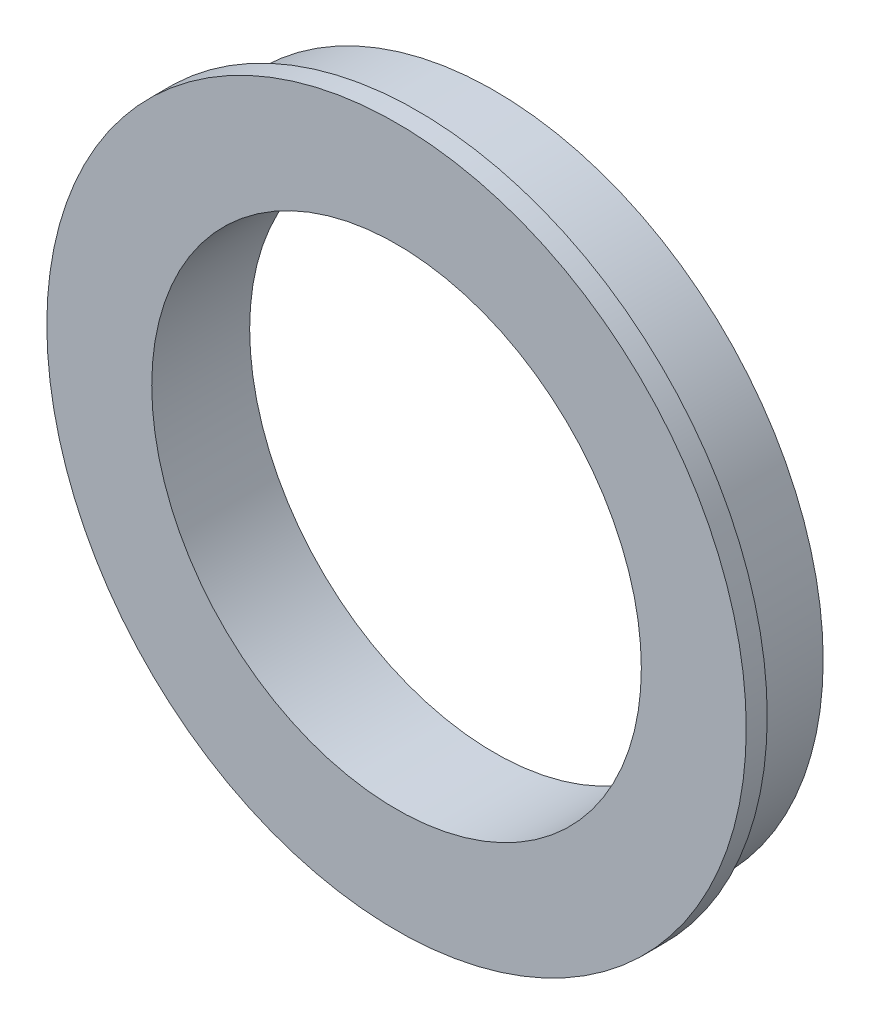
ISO-10303-21;
HEADER;
FILE_DESCRIPTION(('STEP AP214'),'2;1');
FILE_NAME('part.step','',(''),(''),'','','');
FILE_SCHEMA(('AUTOMOTIVE_DESIGN { 1 0 10303 214 1 1 1 1 }'));
ENDSEC;
DATA;
#1=APPLICATION_CONTEXT('core data for automotive mechanical design processes');
#2=APPLICATION_PROTOCOL_DEFINITION('international standard','automotive_design',2000,#1);
#3=PRODUCT_CONTEXT('',#1,'mechanical');
#4=PRODUCT('Part','Part','',(#3));
#5=PRODUCT_RELATED_PRODUCT_CATEGORY('part','',(#4));
#6=PRODUCT_DEFINITION_FORMATION('','',#4);
#7=PRODUCT_DEFINITION_CONTEXT('part definition',#1,'design');
#8=PRODUCT_DEFINITION('design','',#6,#7);
#9=PRODUCT_DEFINITION_SHAPE('','',#8);
#10=(LENGTH_UNIT() NAMED_UNIT(*) SI_UNIT(.MILLI.,.METRE.));
#11=(NAMED_UNIT(*) PLANE_ANGLE_UNIT() SI_UNIT($,.RADIAN.));
#12=(NAMED_UNIT(*) SI_UNIT($,.STERADIAN.) SOLID_ANGLE_UNIT());
#13=UNCERTAINTY_MEASURE_WITH_UNIT(LENGTH_MEASURE(1.E-05),#10,'distance_accuracy_value','');
#14=(GEOMETRIC_REPRESENTATION_CONTEXT(3) GLOBAL_UNCERTAINTY_ASSIGNED_CONTEXT((#13)) GLOBAL_UNIT_ASSIGNED_CONTEXT((#10,
#11,#12)) REPRESENTATION_CONTEXT('',''));
#15=CARTESIAN_POINT('',(0.,0.,0.));
#16=DIRECTION('',(0.,0.,1.));
#17=DIRECTION('',(1.,0.,0.));
#18=AXIS2_PLACEMENT_3D('',#15,#16,#17);
#19=CARTESIAN_POINT('',(0.,0.,0.));
#20=DIRECTION('',(0.,0.,1.));
#21=DIRECTION('',(1.,0.,0.));
#22=AXIS2_PLACEMENT_3D('',#19,#20,#21);
#23=PLANE('',#22);
#24=CARTESIAN_POINT('',(0.,0.,0.));
#25=DIRECTION('',(0.,0.,1.));
#26=DIRECTION('',(1.,0.,0.));
#27=AXIS2_PLACEMENT_3D('',#24,#25,#26);
#28=CIRCLE('',#27,23.5);
#29=CARTESIAN_POINT('',(23.5,0.,0.));
#30=VERTEX_POINT('',#29);
#31=EDGE_CURVE('E43',#30,#30,#28,.T.);
#32=ORIENTED_EDGE('',*,*,#31,.F.);
#33=EDGE_LOOP('',(#32));
#34=FACE_BOUND('',#33,.T.);
#35=CARTESIAN_POINT('',(0.,0.,0.));
#36=DIRECTION('',(0.,0.,1.));
#37=DIRECTION('',(1.,0.,0.));
#38=AXIS2_PLACEMENT_3D('',#35,#36,#37);
#39=CIRCLE('',#38,17.5);
#40=CARTESIAN_POINT('',(17.5,0.,0.));
#41=VERTEX_POINT('',#40);
#42=EDGE_CURVE('E50',#41,#41,#39,.T.);
#43=ORIENTED_EDGE('',*,*,#42,.T.);
#44=EDGE_LOOP('',(#43));
#45=FACE_BOUND('',#44,.T.);
#46=ADVANCED_FACE('F39',(#34,#45),#23,.F.);
#47=CARTESIAN_POINT('',(0.,0.,5.5));
#48=DIRECTION('',(0.,0.,-1.));
#49=DIRECTION('',(-1.,0.,0.));
#50=AXIS2_PLACEMENT_3D('',#47,#48,#49);
#51=CYLINDRICAL_SURFACE('',#50,23.5);
#52=CARTESIAN_POINT('',(0.,0.,5.5));
#53=DIRECTION('',(0.,0.,1.));
#54=DIRECTION('',(1.,0.,0.));
#55=AXIS2_PLACEMENT_3D('',#52,#53,#54);
#56=CIRCLE('',#55,23.5);
#57=CARTESIAN_POINT('',(23.5,0.,5.5));
#58=VERTEX_POINT('',#57);
#59=EDGE_CURVE('E10',#58,#58,#56,.T.);
#60=ORIENTED_EDGE('',*,*,#59,.F.);
#61=EDGE_LOOP('',(#60));
#62=FACE_BOUND('',#61,.T.);
#63=ORIENTED_EDGE('',*,*,#31,.T.);
#64=EDGE_LOOP('',(#63));
#65=FACE_BOUND('',#64,.T.);
#66=ADVANCED_FACE('F41',(#62,#65),#51,.T.);
#67=CARTESIAN_POINT('',(0.,0.,5.5));
#68=DIRECTION('',(0.,0.,-1.));
#69=DIRECTION('',(-1.,0.,0.));
#70=AXIS2_PLACEMENT_3D('',#67,#68,#69);
#71=CYLINDRICAL_SURFACE('',#70,17.5);
#72=ORIENTED_EDGE('',*,*,#42,.F.);
#73=EDGE_LOOP('',(#72));
#74=FACE_BOUND('',#73,.T.);
#75=CARTESIAN_POINT('',(0.,0.,7.));
#76=DIRECTION('',(0.,0.,1.));
#77=DIRECTION('',(1.,0.,0.));
#78=AXIS2_PLACEMENT_3D('',#75,#76,#77);
#79=CIRCLE('',#78,17.5);
#80=CARTESIAN_POINT('',(17.5,0.,7.));
#81=VERTEX_POINT('',#80);
#82=EDGE_CURVE('E58',#81,#81,#79,.T.);
#83=ORIENTED_EDGE('',*,*,#82,.T.);
#84=EDGE_LOOP('',(#83));
#85=FACE_BOUND('',#84,.T.);
#86=ADVANCED_FACE('F64',(#74,#85),#71,.F.);
#87=CARTESIAN_POINT('',(0.,0.,7.));
#88=DIRECTION('',(0.,0.,1.));
#89=DIRECTION('',(1.,0.,0.));
#90=AXIS2_PLACEMENT_3D('',#87,#88,#89);
#91=PLANE('',#90);
#92=CARTESIAN_POINT('',(0.,0.,7.));
#93=DIRECTION('',(0.,0.,1.));
#94=DIRECTION('',(1.,0.,0.));
#95=AXIS2_PLACEMENT_3D('',#92,#93,#94);
#96=CIRCLE('',#95,25.);
#97=CARTESIAN_POINT('',(25.,0.,7.));
#98=VERTEX_POINT('',#97);
#99=EDGE_CURVE('E54',#98,#98,#96,.T.);
#100=ORIENTED_EDGE('',*,*,#99,.T.);
#101=EDGE_LOOP('',(#100));
#102=FACE_BOUND('',#101,.T.);
#103=ORIENTED_EDGE('',*,*,#82,.F.);
#104=EDGE_LOOP('',(#103));
#105=FACE_BOUND('',#104,.T.);
#106=ADVANCED_FACE('F66',(#102,#105),#91,.T.);
#107=CARTESIAN_POINT('',(0.,0.,5.5));
#108=DIRECTION('',(0.,0.,1.));
#109=DIRECTION('',(1.,0.,0.));
#110=AXIS2_PLACEMENT_3D('',#107,#108,#109);
#111=PLANE('',#110);
#112=ORIENTED_EDGE('',*,*,#59,.T.);
#113=EDGE_LOOP('',(#112));
#114=FACE_BOUND('',#113,.T.);
#115=CARTESIAN_POINT('',(0.,0.,5.5));
#116=DIRECTION('',(0.,0.,1.));
#117=DIRECTION('',(1.,0.,0.));
#118=AXIS2_PLACEMENT_3D('',#115,#116,#117);
#119=CIRCLE('',#118,25.);
#120=CARTESIAN_POINT('',(25.,0.,5.5));
#121=VERTEX_POINT('',#120);
#122=EDGE_CURVE('E55',#121,#121,#119,.T.);
#123=ORIENTED_EDGE('',*,*,#122,.F.);
#124=EDGE_LOOP('',(#123));
#125=FACE_BOUND('',#124,.T.);
#126=ADVANCED_FACE('F68',(#114,#125),#111,.F.);
#127=CARTESIAN_POINT('',(0.,0.,7.));
#128=DIRECTION('',(0.,0.,-1.));
#129=DIRECTION('',(-1.,0.,0.));
#130=AXIS2_PLACEMENT_3D('',#127,#128,#129);
#131=CYLINDRICAL_SURFACE('',#130,25.);
#132=ORIENTED_EDGE('',*,*,#99,.F.);
#133=EDGE_LOOP('',(#132));
#134=FACE_BOUND('',#133,.T.);
#135=ORIENTED_EDGE('',*,*,#122,.T.);
#136=EDGE_LOOP('',(#135));
#137=FACE_BOUND('',#136,.T.);
#138=ADVANCED_FACE('F75',(#134,#137),#131,.T.);
#139=CLOSED_SHELL('',(#46,#66,#86,#106,#126,#138));
#140=MANIFOLD_SOLID_BREP('B2',#139);
#141=ADVANCED_BREP_SHAPE_REPRESENTATION('',(#18,#140),#14);
#142=SHAPE_DEFINITION_REPRESENTATION(#9,#141);
ENDSEC;
END-ISO-10303-21;
